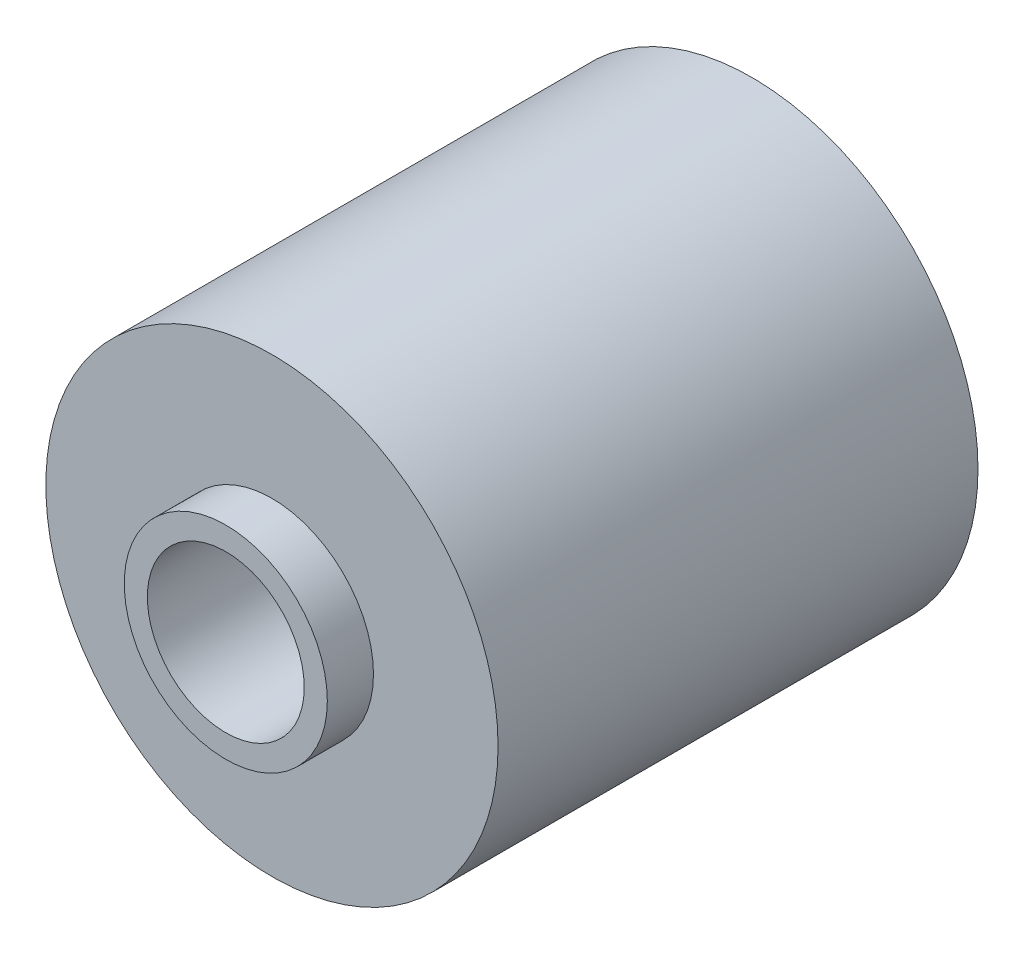
ISO-10303-21;
HEADER;
FILE_DESCRIPTION(('STEP AP214'),'2;1');
FILE_NAME('part.step','',(''),(''),'','','');
FILE_SCHEMA(('AUTOMOTIVE_DESIGN { 1 0 10303 214 1 1 1 1 }'));
ENDSEC;
DATA;
#1=APPLICATION_CONTEXT('core data for automotive mechanical design processes');
#2=APPLICATION_PROTOCOL_DEFINITION('international standard','automotive_design',2000,#1);
#3=PRODUCT_CONTEXT('',#1,'mechanical');
#4=PRODUCT('Part','Part','',(#3));
#5=PRODUCT_RELATED_PRODUCT_CATEGORY('part','',(#4));
#6=PRODUCT_DEFINITION_FORMATION('','',#4);
#7=PRODUCT_DEFINITION_CONTEXT('part definition',#1,'design');
#8=PRODUCT_DEFINITION('design','',#6,#7);
#9=PRODUCT_DEFINITION_SHAPE('','',#8);
#10=(LENGTH_UNIT() NAMED_UNIT(*) SI_UNIT(.MILLI.,.METRE.));
#11=(NAMED_UNIT(*) PLANE_ANGLE_UNIT() SI_UNIT($,.RADIAN.));
#12=(NAMED_UNIT(*) SI_UNIT($,.STERADIAN.) SOLID_ANGLE_UNIT());
#13=UNCERTAINTY_MEASURE_WITH_UNIT(LENGTH_MEASURE(1.E-05),#10,'distance_accuracy_value','');
#14=(GEOMETRIC_REPRESENTATION_CONTEXT(3) GLOBAL_UNCERTAINTY_ASSIGNED_CONTEXT((#13)) GLOBAL_UNIT_ASSIGNED_CONTEXT((#10,
#11,#12)) REPRESENTATION_CONTEXT('',''));
#15=CARTESIAN_POINT('',(0.,0.,0.));
#16=DIRECTION('',(0.,0.,1.));
#17=DIRECTION('',(1.,0.,0.));
#18=AXIS2_PLACEMENT_3D('',#15,#16,#17);
#19=CARTESIAN_POINT('',(0.,0.,10.4));
#20=DIRECTION('',(0.,0.,1.));
#21=DIRECTION('',(1.,0.,0.));
#22=AXIS2_PLACEMENT_3D('',#19,#20,#21);
#23=PLANE('',#22);
#24=CARTESIAN_POINT('',(0.,0.,10.4));
#25=DIRECTION('',(0.,0.,1.));
#26=DIRECTION('',(1.,0.,0.));
#27=AXIS2_PLACEMENT_3D('',#24,#25,#26);
#28=CIRCLE('',#27,4.9);
#29=CARTESIAN_POINT('',(4.9,0.,10.4));
#30=VERTEX_POINT('',#29);
#31=EDGE_CURVE('E10',#30,#30,#28,.T.);
#32=ORIENTED_EDGE('',*,*,#31,.T.);
#33=EDGE_LOOP('',(#32));
#34=FACE_BOUND('',#33,.T.);
#35=CARTESIAN_POINT('',(0.,0.,10.4));
#36=DIRECTION('',(0.,0.,1.));
#37=DIRECTION('',(1.,0.,0.));
#38=AXIS2_PLACEMENT_3D('',#35,#36,#37);
#39=CIRCLE('',#38,2.2);
#40=CARTESIAN_POINT('',(2.2,0.,10.4));
#41=VERTEX_POINT('',#40);
#42=EDGE_CURVE('E52',#41,#41,#39,.T.);
#43=ORIENTED_EDGE('',*,*,#42,.F.);
#44=EDGE_LOOP('',(#43));
#45=FACE_BOUND('',#44,.T.);
#46=ADVANCED_FACE('F37',(#34,#45),#23,.T.);
#47=CARTESIAN_POINT('',(0.,0.,0.));
#48=DIRECTION('',(0.,0.,1.));
#49=DIRECTION('',(1.,0.,0.));
#50=AXIS2_PLACEMENT_3D('',#47,#48,#49);
#51=PLANE('',#50);
#52=CARTESIAN_POINT('',(0.,0.,0.));
#53=DIRECTION('',(0.,0.,1.));
#54=DIRECTION('',(1.,0.,0.));
#55=AXIS2_PLACEMENT_3D('',#52,#53,#54);
#56=CIRCLE('',#55,2.2);
#57=CARTESIAN_POINT('',(2.2,0.,0.));
#58=VERTEX_POINT('',#57);
#59=EDGE_CURVE('E64',#58,#58,#56,.T.);
#60=ORIENTED_EDGE('',*,*,#59,.T.);
#61=EDGE_LOOP('',(#60));
#62=FACE_BOUND('',#61,.T.);
#63=CARTESIAN_POINT('',(0.,0.,0.));
#64=DIRECTION('',(0.,0.,1.));
#65=DIRECTION('',(1.,0.,0.));
#66=AXIS2_PLACEMENT_3D('',#63,#64,#65);
#67=CIRCLE('',#66,4.9);
#68=CARTESIAN_POINT('',(4.9,0.,0.));
#69=VERTEX_POINT('',#68);
#70=EDGE_CURVE('E41',#69,#69,#67,.T.);
#71=ORIENTED_EDGE('',*,*,#70,.F.);
#72=EDGE_LOOP('',(#71));
#73=FACE_BOUND('',#72,.T.);
#74=ADVANCED_FACE('F93',(#62,#73),#51,.F.);
#75=CARTESIAN_POINT('',(0.,0.,10.4));
#76=DIRECTION('',(0.,0.,-1.));
#77=DIRECTION('',(-1.,0.,0.));
#78=AXIS2_PLACEMENT_3D('',#75,#76,#77);
#79=CYLINDRICAL_SURFACE('',#78,4.9);
#80=ORIENTED_EDGE('',*,*,#31,.F.);
#81=EDGE_LOOP('',(#80));
#82=FACE_BOUND('',#81,.T.);
#83=ORIENTED_EDGE('',*,*,#70,.T.);
#84=EDGE_LOOP('',(#83));
#85=FACE_BOUND('',#84,.T.);
#86=ADVANCED_FACE('F39',(#82,#85),#79,.T.);
#87=CARTESIAN_POINT('',(0.,0.,10.4));
#88=DIRECTION('',(0.,0.,-1.));
#89=DIRECTION('',(-1.,0.,0.));
#90=AXIS2_PLACEMENT_3D('',#87,#88,#89);
#91=CYLINDRICAL_SURFACE('',#90,1.7);
#92=CARTESIAN_POINT('',(0.,0.,11.4));
#93=DIRECTION('',(0.,0.,1.));
#94=DIRECTION('',(1.,0.,0.));
#95=AXIS2_PLACEMENT_3D('',#92,#93,#94);
#96=CIRCLE('',#95,1.7);
#97=CARTESIAN_POINT('',(1.7,0.,11.4));
#98=VERTEX_POINT('',#97);
#99=EDGE_CURVE('E56',#98,#98,#96,.T.);
#100=ORIENTED_EDGE('',*,*,#99,.T.);
#101=EDGE_LOOP('',(#100));
#102=FACE_BOUND('',#101,.T.);
#103=CARTESIAN_POINT('',(0.,0.,-1.));
#104=DIRECTION('',(0.,0.,1.));
#105=DIRECTION('',(1.,0.,0.));
#106=AXIS2_PLACEMENT_3D('',#103,#104,#105);
#107=CIRCLE('',#106,1.7);
#108=CARTESIAN_POINT('',(1.7,0.,-1.));
#109=VERTEX_POINT('',#108);
#110=EDGE_CURVE('E68',#109,#109,#107,.T.);
#111=ORIENTED_EDGE('',*,*,#110,.F.);
#112=EDGE_LOOP('',(#111));
#113=FACE_BOUND('',#112,.T.);
#114=ADVANCED_FACE('F79',(#102,#113),#91,.F.);
#115=CARTESIAN_POINT('',(0.,0.,11.4));
#116=DIRECTION('',(0.,0.,1.));
#117=DIRECTION('',(1.,0.,0.));
#118=AXIS2_PLACEMENT_3D('',#115,#116,#117);
#119=PLANE('',#118);
#120=CARTESIAN_POINT('',(0.,0.,11.4));
#121=DIRECTION('',(0.,0.,1.));
#122=DIRECTION('',(1.,0.,0.));
#123=AXIS2_PLACEMENT_3D('',#120,#121,#122);
#124=CIRCLE('',#123,2.2);
#125=CARTESIAN_POINT('',(2.2,0.,11.4));
#126=VERTEX_POINT('',#125);
#127=EDGE_CURVE('E50',#126,#126,#124,.T.);
#128=ORIENTED_EDGE('',*,*,#127,.T.);
#129=EDGE_LOOP('',(#128));
#130=FACE_BOUND('',#129,.T.);
#131=ORIENTED_EDGE('',*,*,#99,.F.);
#132=EDGE_LOOP('',(#131));
#133=FACE_BOUND('',#132,.T.);
#134=ADVANCED_FACE('F81',(#130,#133),#119,.T.);
#135=CARTESIAN_POINT('',(0.,0.,11.4));
#136=DIRECTION('',(0.,0.,-1.));
#137=DIRECTION('',(-1.,0.,0.));
#138=AXIS2_PLACEMENT_3D('',#135,#136,#137);
#139=CYLINDRICAL_SURFACE('',#138,2.2);
#140=ORIENTED_EDGE('',*,*,#127,.F.);
#141=EDGE_LOOP('',(#140));
#142=FACE_BOUND('',#141,.T.);
#143=ORIENTED_EDGE('',*,*,#42,.T.);
#144=EDGE_LOOP('',(#143));
#145=FACE_BOUND('',#144,.T.);
#146=ADVANCED_FACE('F89',(#142,#145),#139,.T.);
#147=CARTESIAN_POINT('',(0.,0.,-1.));
#148=DIRECTION('',(0.,0.,1.));
#149=DIRECTION('',(1.,0.,0.));
#150=AXIS2_PLACEMENT_3D('',#147,#148,#149);
#151=CYLINDRICAL_SURFACE('',#150,2.2);
#152=CARTESIAN_POINT('',(0.,0.,-1.));
#153=DIRECTION('',(0.,0.,1.));
#154=DIRECTION('',(1.,0.,0.));
#155=AXIS2_PLACEMENT_3D('',#152,#153,#154);
#156=CIRCLE('',#155,2.2);
#157=CARTESIAN_POINT('',(2.2,0.,-1.));
#158=VERTEX_POINT('',#157);
#159=EDGE_CURVE('E63',#158,#158,#156,.T.);
#160=ORIENTED_EDGE('',*,*,#159,.T.);
#161=EDGE_LOOP('',(#160));
#162=FACE_BOUND('',#161,.T.);
#163=ORIENTED_EDGE('',*,*,#59,.F.);
#164=EDGE_LOOP('',(#163));
#165=FACE_BOUND('',#164,.T.);
#166=ADVANCED_FACE('F106',(#162,#165),#151,.T.);
#167=CARTESIAN_POINT('',(0.,0.,-1.));
#168=DIRECTION('',(0.,0.,1.));
#169=DIRECTION('',(1.,0.,0.));
#170=AXIS2_PLACEMENT_3D('',#167,#168,#169);
#171=PLANE('',#170);
#172=ORIENTED_EDGE('',*,*,#110,.T.);
#173=EDGE_LOOP('',(#172));
#174=FACE_BOUND('',#173,.T.);
#175=ORIENTED_EDGE('',*,*,#159,.F.);
#176=EDGE_LOOP('',(#175));
#177=FACE_BOUND('',#176,.T.);
#178=ADVANCED_FACE('F76',(#174,#177),#171,.F.);
#179=CLOSED_SHELL('',(#46,#74,#86,#114,#134,#146,#166,#178));
#180=MANIFOLD_SOLID_BREP('B2',#179);
#181=ADVANCED_BREP_SHAPE_REPRESENTATION('',(#18,#180),#14);
#182=SHAPE_DEFINITION_REPRESENTATION(#9,#181);
ENDSEC;
END-ISO-10303-21;
